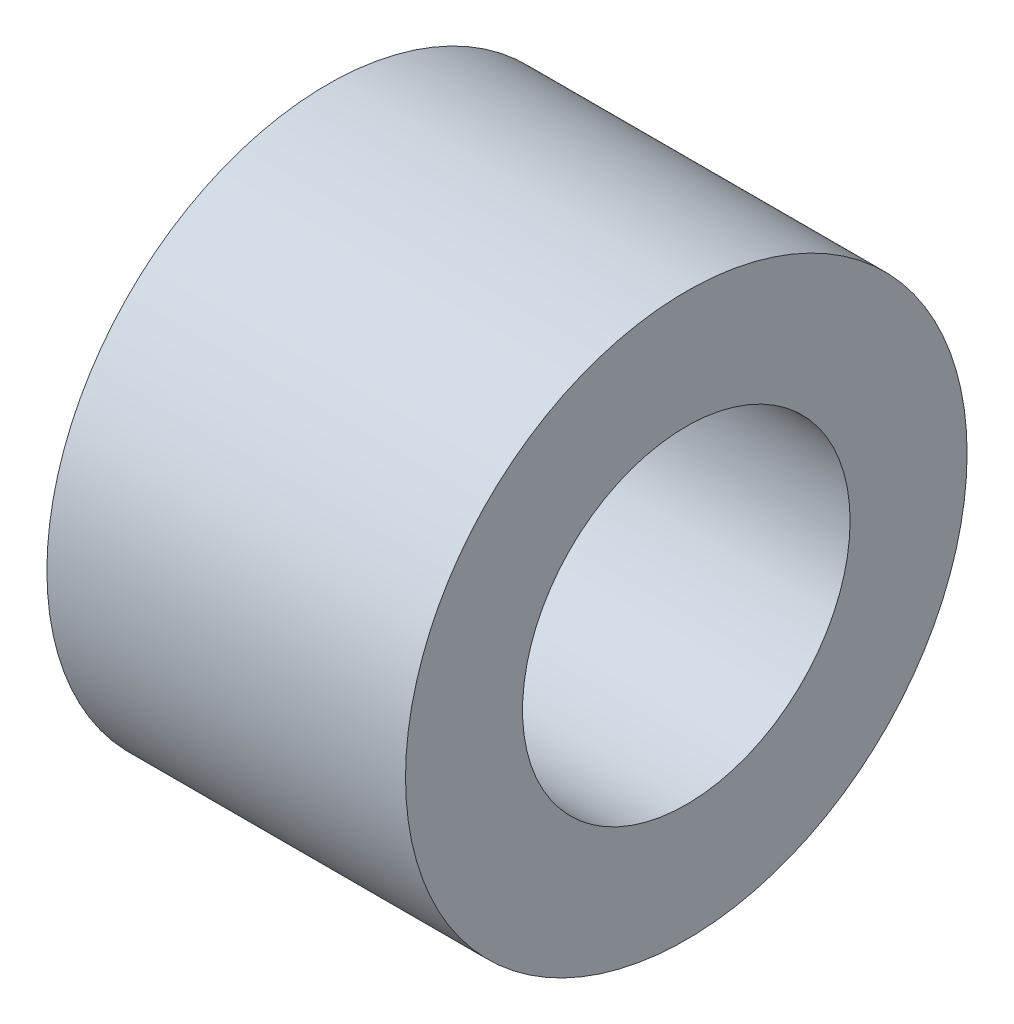
ISO-10303-21;
HEADER;
FILE_DESCRIPTION(('STEP AP214'),'2;1');
FILE_NAME('part.step','',(''),(''),'','','');
FILE_SCHEMA(('AUTOMOTIVE_DESIGN { 1 0 10303 214 1 1 1 1 }'));
ENDSEC;
DATA;
#1=APPLICATION_CONTEXT('core data for automotive mechanical design processes');
#2=APPLICATION_PROTOCOL_DEFINITION('international standard','automotive_design',2000,#1);
#3=PRODUCT_CONTEXT('',#1,'mechanical');
#4=PRODUCT('Part','Part','',(#3));
#5=PRODUCT_RELATED_PRODUCT_CATEGORY('part','',(#4));
#6=PRODUCT_DEFINITION_FORMATION('','',#4);
#7=PRODUCT_DEFINITION_CONTEXT('part definition',#1,'design');
#8=PRODUCT_DEFINITION('design','',#6,#7);
#9=PRODUCT_DEFINITION_SHAPE('','',#8);
#10=(LENGTH_UNIT() NAMED_UNIT(*) SI_UNIT(.MILLI.,.METRE.));
#11=(NAMED_UNIT(*) PLANE_ANGLE_UNIT() SI_UNIT($,.RADIAN.));
#12=(NAMED_UNIT(*) SI_UNIT($,.STERADIAN.) SOLID_ANGLE_UNIT());
#13=UNCERTAINTY_MEASURE_WITH_UNIT(LENGTH_MEASURE(1.E-05),#10,'distance_accuracy_value','');
#14=(GEOMETRIC_REPRESENTATION_CONTEXT(3) GLOBAL_UNCERTAINTY_ASSIGNED_CONTEXT((#13)) GLOBAL_UNIT_ASSIGNED_CONTEXT((#10,
#11,#12)) REPRESENTATION_CONTEXT('',''));
#15=CARTESIAN_POINT('',(0.,0.,0.));
#16=DIRECTION('',(0.,0.,1.));
#17=DIRECTION('',(1.,0.,0.));
#18=AXIS2_PLACEMENT_3D('',#15,#16,#17);
#19=CARTESIAN_POINT('',(7.6632968625597,0.,0.));
#20=DIRECTION('',(1.,0.,0.));
#21=DIRECTION('',(0.,0.,-1.));
#22=AXIS2_PLACEMENT_3D('',#19,#20,#21);
#23=PLANE('',#22);
#24=CARTESIAN_POINT('',(7.6632968625597,0.,0.));
#25=DIRECTION('',(1.,0.,0.));
#26=DIRECTION('',(0.,0.,-1.));
#27=AXIS2_PLACEMENT_3D('',#24,#25,#26);
#28=CIRCLE('',#27,6.);
#29=CARTESIAN_POINT('',(7.6632968625597,0.,-6.));
#30=VERTEX_POINT('',#29);
#31=EDGE_CURVE('E10',#30,#30,#28,.T.);
#32=ORIENTED_EDGE('',*,*,#31,.T.);
#33=EDGE_LOOP('',(#32));
#34=FACE_BOUND('',#33,.T.);
#35=CARTESIAN_POINT('',(7.6632968625597,0.,0.));
#36=DIRECTION('',(1.,0.,0.));
#37=DIRECTION('',(0.,0.,-1.));
#38=AXIS2_PLACEMENT_3D('',#35,#36,#37);
#39=CIRCLE('',#38,3.5);
#40=CARTESIAN_POINT('',(7.6632968625597,0.,-3.5));
#41=VERTEX_POINT('',#40);
#42=EDGE_CURVE('E50',#41,#41,#39,.T.);
#43=ORIENTED_EDGE('',*,*,#42,.F.);
#44=EDGE_LOOP('',(#43));
#45=FACE_BOUND('',#44,.T.);
#46=ADVANCED_FACE('F37',(#34,#45),#23,.T.);
#47=CARTESIAN_POINT('',(0.,0.,0.));
#48=DIRECTION('',(1.,0.,0.));
#49=DIRECTION('',(0.,0.,-1.));
#50=AXIS2_PLACEMENT_3D('',#47,#48,#49);
#51=PLANE('',#50);
#52=CARTESIAN_POINT('',(0.,0.,0.));
#53=DIRECTION('',(1.,0.,0.));
#54=DIRECTION('',(0.,0.,-1.));
#55=AXIS2_PLACEMENT_3D('',#52,#53,#54);
#56=CIRCLE('',#55,6.);
#57=CARTESIAN_POINT('',(0.,0.,-6.));
#58=VERTEX_POINT('',#57);
#59=EDGE_CURVE('E41',#58,#58,#56,.T.);
#60=ORIENTED_EDGE('',*,*,#59,.F.);
#61=EDGE_LOOP('',(#60));
#62=FACE_BOUND('',#61,.T.);
#63=CARTESIAN_POINT('',(0.,0.,0.));
#64=DIRECTION('',(1.,0.,0.));
#65=DIRECTION('',(0.,0.,-1.));
#66=AXIS2_PLACEMENT_3D('',#63,#64,#65);
#67=CIRCLE('',#66,3.5);
#68=CARTESIAN_POINT('',(0.,0.,-3.5));
#69=VERTEX_POINT('',#68);
#70=EDGE_CURVE('E52',#69,#69,#67,.T.);
#71=ORIENTED_EDGE('',*,*,#70,.T.);
#72=EDGE_LOOP('',(#71));
#73=FACE_BOUND('',#72,.T.);
#74=ADVANCED_FACE('F64',(#62,#73),#51,.F.);
#75=CARTESIAN_POINT('',(7.6632968625597,0.,0.));
#76=DIRECTION('',(-1.,0.,0.));
#77=DIRECTION('',(0.,0.,1.));
#78=AXIS2_PLACEMENT_3D('',#75,#76,#77);
#79=CYLINDRICAL_SURFACE('',#78,6.);
#80=ORIENTED_EDGE('',*,*,#31,.F.);
#81=EDGE_LOOP('',(#80));
#82=FACE_BOUND('',#81,.T.);
#83=ORIENTED_EDGE('',*,*,#59,.T.);
#84=EDGE_LOOP('',(#83));
#85=FACE_BOUND('',#84,.T.);
#86=ADVANCED_FACE('F39',(#82,#85),#79,.T.);
#87=CARTESIAN_POINT('',(7.6632968625597,0.,0.));
#88=DIRECTION('',(-1.,0.,0.));
#89=DIRECTION('',(0.,0.,1.));
#90=AXIS2_PLACEMENT_3D('',#87,#88,#89);
#91=CYLINDRICAL_SURFACE('',#90,3.5);
#92=ORIENTED_EDGE('',*,*,#42,.T.);
#93=EDGE_LOOP('',(#92));
#94=FACE_BOUND('',#93,.T.);
#95=ORIENTED_EDGE('',*,*,#70,.F.);
#96=EDGE_LOOP('',(#95));
#97=FACE_BOUND('',#96,.T.);
#98=ADVANCED_FACE('F60',(#94,#97),#91,.F.);
#99=CLOSED_SHELL('',(#46,#74,#86,#98));
#100=MANIFOLD_SOLID_BREP('B2',#99);
#101=ADVANCED_BREP_SHAPE_REPRESENTATION('',(#18,#100),#14);
#102=SHAPE_DEFINITION_REPRESENTATION(#9,#101);
ENDSEC;
END-ISO-10303-21;
